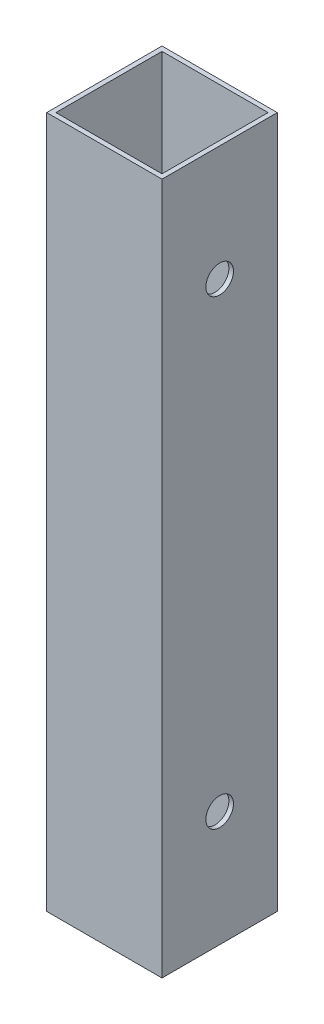
ISO-10303-21;
HEADER;
FILE_DESCRIPTION(('STEP AP214'),'2;1');
FILE_NAME('part.step','',(''),(''),'','','');
FILE_SCHEMA(('AUTOMOTIVE_DESIGN { 1 0 10303 214 1 1 1 1 }'));
ENDSEC;
DATA;
#1=APPLICATION_CONTEXT('core data for automotive mechanical design processes');
#2=APPLICATION_PROTOCOL_DEFINITION('international standard','automotive_design',2000,#1);
#3=PRODUCT_CONTEXT('',#1,'mechanical');
#4=PRODUCT('Part','Part','',(#3));
#5=PRODUCT_RELATED_PRODUCT_CATEGORY('part','',(#4));
#6=PRODUCT_DEFINITION_FORMATION('','',#4);
#7=PRODUCT_DEFINITION_CONTEXT('part definition',#1,'design');
#8=PRODUCT_DEFINITION('design','',#6,#7);
#9=PRODUCT_DEFINITION_SHAPE('','',#8);
#10=(LENGTH_UNIT() NAMED_UNIT(*) SI_UNIT(.MILLI.,.METRE.));
#11=(NAMED_UNIT(*) PLANE_ANGLE_UNIT() SI_UNIT($,.RADIAN.));
#12=(NAMED_UNIT(*) SI_UNIT($,.STERADIAN.) SOLID_ANGLE_UNIT());
#13=UNCERTAINTY_MEASURE_WITH_UNIT(LENGTH_MEASURE(1.E-05),#10,'distance_accuracy_value','');
#14=(GEOMETRIC_REPRESENTATION_CONTEXT(3) GLOBAL_UNCERTAINTY_ASSIGNED_CONTEXT((#13)) GLOBAL_UNIT_ASSIGNED_CONTEXT((#10,
#11,#12)) REPRESENTATION_CONTEXT('',''));
#15=CARTESIAN_POINT('',(0.,0.,0.));
#16=DIRECTION('',(0.,0.,1.));
#17=DIRECTION('',(1.,0.,0.));
#18=AXIS2_PLACEMENT_3D('',#15,#16,#17);
#19=CARTESIAN_POINT('',(0.,150.,0.));
#20=DIRECTION('',(0.,-1.,0.));
#21=DIRECTION('',(0.,0.,-1.));
#22=AXIS2_PLACEMENT_3D('',#19,#20,#21);
#23=PLANE('',#22);
#24=DIRECTION('',(0.,0.,-1.));
#25=VECTOR('',#24,1.);
#26=CARTESIAN_POINT('',(12.5,150.,12.5));
#27=LINE('',#26,#25);
#28=CARTESIAN_POINT('',(12.5,150.,12.5));
#29=VERTEX_POINT('',#28);
#30=CARTESIAN_POINT('',(12.5,150.,-12.5));
#31=VERTEX_POINT('',#30);
#32=EDGE_CURVE('E142',#29,#31,#27,.T.);
#33=ORIENTED_EDGE('',*,*,#32,.T.);
#34=DIRECTION('',(-1.,0.,0.));
#35=VECTOR('',#34,1.);
#36=CARTESIAN_POINT('',(-12.5,150.,-12.5));
#37=LINE('',#36,#35);
#38=CARTESIAN_POINT('',(-12.5,150.,-12.5));
#39=VERTEX_POINT('',#38);
#40=EDGE_CURVE('E145',#31,#39,#37,.T.);
#41=ORIENTED_EDGE('',*,*,#40,.T.);
#42=DIRECTION('',(0.,0.,1.));
#43=VECTOR('',#42,1.);
#44=CARTESIAN_POINT('',(-12.5,150.,12.5));
#45=LINE('',#44,#43);
#46=CARTESIAN_POINT('',(-12.5,150.,12.5));
#47=VERTEX_POINT('',#46);
#48=EDGE_CURVE('E148',#39,#47,#45,.T.);
#49=ORIENTED_EDGE('',*,*,#48,.T.);
#50=DIRECTION('',(1.,0.,0.));
#51=VECTOR('',#50,1.);
#52=CARTESIAN_POINT('',(-12.5,150.,12.5));
#53=LINE('',#52,#51);
#54=EDGE_CURVE('E150',#47,#29,#53,.T.);
#55=ORIENTED_EDGE('',*,*,#54,.T.);
#56=EDGE_LOOP('',(#33,#41,#49,#55));
#57=FACE_BOUND('',#56,.T.);
#58=DIRECTION('',(0.,0.,1.));
#59=VECTOR('',#58,1.);
#60=CARTESIAN_POINT('',(-11.5,150.,11.5));
#61=LINE('',#60,#59);
#62=CARTESIAN_POINT('',(-11.5,150.,-11.5));
#63=VERTEX_POINT('',#62);
#64=CARTESIAN_POINT('',(-11.5,150.,11.5));
#65=VERTEX_POINT('',#64);
#66=EDGE_CURVE('E104',#63,#65,#61,.T.);
#67=ORIENTED_EDGE('',*,*,#66,.F.);
#68=DIRECTION('',(-1.,0.,0.));
#69=VECTOR('',#68,1.);
#70=CARTESIAN_POINT('',(-11.5,150.,-11.5));
#71=LINE('',#70,#69);
#72=CARTESIAN_POINT('',(11.5,150.,-11.5));
#73=VERTEX_POINT('',#72);
#74=EDGE_CURVE('E126',#73,#63,#71,.T.);
#75=ORIENTED_EDGE('',*,*,#74,.F.);
#76=DIRECTION('',(0.,0.,-1.));
#77=VECTOR('',#76,1.);
#78=CARTESIAN_POINT('',(11.5,150.,11.5));
#79=LINE('',#78,#77);
#80=CARTESIAN_POINT('',(11.5,150.,11.5));
#81=VERTEX_POINT('',#80);
#82=EDGE_CURVE('E124',#81,#73,#79,.T.);
#83=ORIENTED_EDGE('',*,*,#82,.F.);
#84=DIRECTION('',(1.,0.,0.));
#85=VECTOR('',#84,1.);
#86=CARTESIAN_POINT('',(-11.5,150.,11.5));
#87=LINE('',#86,#85);
#88=EDGE_CURVE('E112',#65,#81,#87,.T.);
#89=ORIENTED_EDGE('',*,*,#88,.F.);
#90=EDGE_LOOP('',(#67,#75,#83,#89));
#91=FACE_BOUND('',#90,.T.);
#92=ADVANCED_FACE('F37',(#57,#91),#23,.F.);
#93=CARTESIAN_POINT('',(0.,0.,0.));
#94=DIRECTION('',(0.,-1.,0.));
#95=DIRECTION('',(0.,0.,-1.));
#96=AXIS2_PLACEMENT_3D('',#93,#94,#95);
#97=PLANE('',#96);
#98=DIRECTION('',(0.,0.,-1.));
#99=VECTOR('',#98,1.);
#100=CARTESIAN_POINT('',(12.5,0.,12.5));
#101=LINE('',#100,#99);
#102=CARTESIAN_POINT('',(12.5,0.,12.5));
#103=VERTEX_POINT('',#102);
#104=CARTESIAN_POINT('',(12.5,0.,-12.5));
#105=VERTEX_POINT('',#104);
#106=EDGE_CURVE('E120',#103,#105,#101,.T.);
#107=ORIENTED_EDGE('',*,*,#106,.F.);
#108=DIRECTION('',(1.,0.,0.));
#109=VECTOR('',#108,1.);
#110=CARTESIAN_POINT('',(-12.5,0.,12.5));
#111=LINE('',#110,#109);
#112=CARTESIAN_POINT('',(-12.5,0.,12.5));
#113=VERTEX_POINT('',#112);
#114=EDGE_CURVE('E146',#113,#103,#111,.T.);
#115=ORIENTED_EDGE('',*,*,#114,.F.);
#116=DIRECTION('',(0.,0.,1.));
#117=VECTOR('',#116,1.);
#118=CARTESIAN_POINT('',(-12.5,0.,12.5));
#119=LINE('',#118,#117);
#120=CARTESIAN_POINT('',(-12.5,0.,-12.5));
#121=VERTEX_POINT('',#120);
#122=EDGE_CURVE('E157',#121,#113,#119,.T.);
#123=ORIENTED_EDGE('',*,*,#122,.F.);
#124=DIRECTION('',(-1.,0.,0.));
#125=VECTOR('',#124,1.);
#126=CARTESIAN_POINT('',(-12.5,0.,-12.5));
#127=LINE('',#126,#125);
#128=EDGE_CURVE('E155',#105,#121,#127,.T.);
#129=ORIENTED_EDGE('',*,*,#128,.F.);
#130=EDGE_LOOP('',(#107,#115,#123,#129));
#131=FACE_BOUND('',#130,.T.);
#132=DIRECTION('',(-1.,0.,0.));
#133=VECTOR('',#132,1.);
#134=CARTESIAN_POINT('',(-11.5,0.,-11.5));
#135=LINE('',#134,#133);
#136=CARTESIAN_POINT('',(11.5,0.,-11.5));
#137=VERTEX_POINT('',#136);
#138=CARTESIAN_POINT('',(-11.5,0.,-11.5));
#139=VERTEX_POINT('',#138);
#140=EDGE_CURVE('E113',#137,#139,#135,.T.);
#141=ORIENTED_EDGE('',*,*,#140,.T.);
#142=DIRECTION('',(0.,0.,1.));
#143=VECTOR('',#142,1.);
#144=CARTESIAN_POINT('',(-11.5,0.,11.5));
#145=LINE('',#144,#143);
#146=CARTESIAN_POINT('',(-11.5,0.,11.5));
#147=VERTEX_POINT('',#146);
#148=EDGE_CURVE('E62',#139,#147,#145,.T.);
#149=ORIENTED_EDGE('',*,*,#148,.T.);
#150=DIRECTION('',(1.,0.,0.));
#151=VECTOR('',#150,1.);
#152=CARTESIAN_POINT('',(-11.5,0.,11.5));
#153=LINE('',#152,#151);
#154=CARTESIAN_POINT('',(11.5,0.,11.5));
#155=VERTEX_POINT('',#154);
#156=EDGE_CURVE('E119',#147,#155,#153,.T.);
#157=ORIENTED_EDGE('',*,*,#156,.T.);
#158=DIRECTION('',(0.,0.,-1.));
#159=VECTOR('',#158,1.);
#160=CARTESIAN_POINT('',(11.5,0.,11.5));
#161=LINE('',#160,#159);
#162=EDGE_CURVE('E134',#155,#137,#161,.T.);
#163=ORIENTED_EDGE('',*,*,#162,.T.);
#164=EDGE_LOOP('',(#141,#149,#157,#163));
#165=FACE_BOUND('',#164,.T.);
#166=ADVANCED_FACE('F204',(#131,#165),#97,.T.);
#167=CARTESIAN_POINT('',(12.5,150.,12.5));
#168=DIRECTION('',(-1.,0.,0.));
#169=DIRECTION('',(0.,0.,1.));
#170=AXIS2_PLACEMENT_3D('',#167,#168,#169);
#171=PLANE('',#170);
#172=CARTESIAN_POINT('',(12.5,125.,0.));
#173=DIRECTION('',(1.,0.,0.));
#174=DIRECTION('',(0.,0.,-1.));
#175=AXIS2_PLACEMENT_3D('',#172,#173,#174);
#176=CIRCLE('',#175,3.);
#177=CARTESIAN_POINT('',(12.5,125.,-3.));
#178=VERTEX_POINT('',#177);
#179=EDGE_CURVE('E175',#178,#178,#176,.T.);
#180=ORIENTED_EDGE('',*,*,#179,.F.);
#181=EDGE_LOOP('',(#180));
#182=FACE_BOUND('',#181,.T.);
#183=CARTESIAN_POINT('',(12.5,25.,0.));
#184=DIRECTION('',(1.,0.,0.));
#185=DIRECTION('',(0.,0.,-1.));
#186=AXIS2_PLACEMENT_3D('',#183,#184,#185);
#187=CIRCLE('',#186,3.);
#188=CARTESIAN_POINT('',(12.5,25.,-3.));
#189=VERTEX_POINT('',#188);
#190=EDGE_CURVE('E180',#189,#189,#187,.T.);
#191=ORIENTED_EDGE('',*,*,#190,.F.);
#192=EDGE_LOOP('',(#191));
#193=FACE_BOUND('',#192,.T.);
#194=ORIENTED_EDGE('',*,*,#106,.T.);
#195=DIRECTION('',(0.,-1.,0.));
#196=VECTOR('',#195,1.);
#197=CARTESIAN_POINT('',(12.5,150.,-12.5));
#198=LINE('',#197,#196);
#199=EDGE_CURVE('E11',#31,#105,#198,.T.);
#200=ORIENTED_EDGE('',*,*,#199,.F.);
#201=ORIENTED_EDGE('',*,*,#32,.F.);
#202=DIRECTION('',(0.,-1.,0.));
#203=VECTOR('',#202,1.);
#204=CARTESIAN_POINT('',(12.5,150.,12.5));
#205=LINE('',#204,#203);
#206=EDGE_CURVE('E152',#29,#103,#205,.T.);
#207=ORIENTED_EDGE('',*,*,#206,.T.);
#208=EDGE_LOOP('',(#194,#200,#201,#207));
#209=FACE_BOUND('',#208,.T.);
#210=ADVANCED_FACE('F39',(#182,#193,#209),#171,.F.);
#211=CARTESIAN_POINT('',(-12.5,150.,-12.5));
#212=DIRECTION('',(0.,0.,1.));
#213=DIRECTION('',(1.,0.,0.));
#214=AXIS2_PLACEMENT_3D('',#211,#212,#213);
#215=PLANE('',#214);
#216=ORIENTED_EDGE('',*,*,#128,.T.);
#217=DIRECTION('',(0.,-1.,0.));
#218=VECTOR('',#217,1.);
#219=CARTESIAN_POINT('',(-12.5,150.,-12.5));
#220=LINE('',#219,#218);
#221=EDGE_CURVE('E46',#39,#121,#220,.T.);
#222=ORIENTED_EDGE('',*,*,#221,.F.);
#223=ORIENTED_EDGE('',*,*,#40,.F.);
#224=ORIENTED_EDGE('',*,*,#199,.T.);
#225=EDGE_LOOP('',(#216,#222,#223,#224));
#226=FACE_BOUND('',#225,.T.);
#227=ADVANCED_FACE('F230',(#226),#215,.F.);
#228=CARTESIAN_POINT('',(-12.5,150.,12.5));
#229=DIRECTION('',(1.,0.,0.));
#230=DIRECTION('',(0.,0.,-1.));
#231=AXIS2_PLACEMENT_3D('',#228,#229,#230);
#232=PLANE('',#231);
#233=CARTESIAN_POINT('',(-12.5,125.,0.));
#234=DIRECTION('',(1.,0.,0.));
#235=DIRECTION('',(0.,0.,-1.));
#236=AXIS2_PLACEMENT_3D('',#233,#234,#235);
#237=CIRCLE('',#236,3.);
#238=CARTESIAN_POINT('',(-12.5,125.,-3.));
#239=VERTEX_POINT('',#238);
#240=EDGE_CURVE('E169',#239,#239,#237,.T.);
#241=ORIENTED_EDGE('',*,*,#240,.T.);
#242=EDGE_LOOP('',(#241));
#243=FACE_BOUND('',#242,.T.);
#244=CARTESIAN_POINT('',(-12.5,25.,0.));
#245=DIRECTION('',(1.,0.,0.));
#246=DIRECTION('',(0.,0.,-1.));
#247=AXIS2_PLACEMENT_3D('',#244,#245,#246);
#248=CIRCLE('',#247,3.);
#249=CARTESIAN_POINT('',(-12.5,25.,-3.));
#250=VERTEX_POINT('',#249);
#251=EDGE_CURVE('E185',#250,#250,#248,.T.);
#252=ORIENTED_EDGE('',*,*,#251,.T.);
#253=EDGE_LOOP('',(#252));
#254=FACE_BOUND('',#253,.T.);
#255=ORIENTED_EDGE('',*,*,#122,.T.);
#256=DIRECTION('',(0.,-1.,0.));
#257=VECTOR('',#256,1.);
#258=CARTESIAN_POINT('',(-12.5,150.,12.5));
#259=LINE('',#258,#257);
#260=EDGE_CURVE('E162',#47,#113,#259,.T.);
#261=ORIENTED_EDGE('',*,*,#260,.F.);
#262=ORIENTED_EDGE('',*,*,#48,.F.);
#263=ORIENTED_EDGE('',*,*,#221,.T.);
#264=EDGE_LOOP('',(#255,#261,#262,#263));
#265=FACE_BOUND('',#264,.T.);
#266=ADVANCED_FACE('F227',(#243,#254,#265),#232,.F.);
#267=CARTESIAN_POINT('',(-12.5,150.,12.5));
#268=DIRECTION('',(0.,0.,-1.));
#269=DIRECTION('',(-1.,0.,0.));
#270=AXIS2_PLACEMENT_3D('',#267,#268,#269);
#271=PLANE('',#270);
#272=ORIENTED_EDGE('',*,*,#114,.T.);
#273=ORIENTED_EDGE('',*,*,#206,.F.);
#274=ORIENTED_EDGE('',*,*,#54,.F.);
#275=ORIENTED_EDGE('',*,*,#260,.T.);
#276=EDGE_LOOP('',(#272,#273,#274,#275));
#277=FACE_BOUND('',#276,.T.);
#278=ADVANCED_FACE('F224',(#277),#271,.F.);
#279=CARTESIAN_POINT('',(-11.5,150.,11.5));
#280=DIRECTION('',(1.,0.,0.));
#281=DIRECTION('',(0.,0.,-1.));
#282=AXIS2_PLACEMENT_3D('',#279,#280,#281);
#283=PLANE('',#282);
#284=CARTESIAN_POINT('',(-11.5,125.,0.));
#285=DIRECTION('',(1.,0.,0.));
#286=DIRECTION('',(0.,0.,-1.));
#287=AXIS2_PLACEMENT_3D('',#284,#285,#286);
#288=CIRCLE('',#287,3.);
#289=CARTESIAN_POINT('',(-11.5,125.,-3.));
#290=VERTEX_POINT('',#289);
#291=EDGE_CURVE('E132',#290,#290,#288,.T.);
#292=ORIENTED_EDGE('',*,*,#291,.F.);
#293=EDGE_LOOP('',(#292));
#294=FACE_BOUND('',#293,.T.);
#295=CARTESIAN_POINT('',(-11.5,25.,0.));
#296=DIRECTION('',(1.,0.,0.));
#297=DIRECTION('',(0.,0.,-1.));
#298=AXIS2_PLACEMENT_3D('',#295,#296,#297);
#299=CIRCLE('',#298,3.);
#300=CARTESIAN_POINT('',(-11.5,25.,-3.));
#301=VERTEX_POINT('',#300);
#302=EDGE_CURVE('E168',#301,#301,#299,.T.);
#303=ORIENTED_EDGE('',*,*,#302,.F.);
#304=EDGE_LOOP('',(#303));
#305=FACE_BOUND('',#304,.T.);
#306=ORIENTED_EDGE('',*,*,#148,.F.);
#307=DIRECTION('',(0.,-1.,0.));
#308=VECTOR('',#307,1.);
#309=CARTESIAN_POINT('',(-11.5,150.,-11.5));
#310=LINE('',#309,#308);
#311=EDGE_CURVE('E108',#63,#139,#310,.T.);
#312=ORIENTED_EDGE('',*,*,#311,.F.);
#313=ORIENTED_EDGE('',*,*,#66,.T.);
#314=DIRECTION('',(0.,-1.,0.));
#315=VECTOR('',#314,1.);
#316=CARTESIAN_POINT('',(-11.5,150.,11.5));
#317=LINE('',#316,#315);
#318=EDGE_CURVE('E107',#65,#147,#317,.T.);
#319=ORIENTED_EDGE('',*,*,#318,.T.);
#320=EDGE_LOOP('',(#306,#312,#313,#319));
#321=FACE_BOUND('',#320,.T.);
#322=ADVANCED_FACE('F106',(#294,#305,#321),#283,.T.);
#323=CARTESIAN_POINT('',(-11.5,150.,11.5));
#324=DIRECTION('',(0.,0.,-1.));
#325=DIRECTION('',(-1.,0.,0.));
#326=AXIS2_PLACEMENT_3D('',#323,#324,#325);
#327=PLANE('',#326);
#328=ORIENTED_EDGE('',*,*,#156,.F.);
#329=ORIENTED_EDGE('',*,*,#318,.F.);
#330=ORIENTED_EDGE('',*,*,#88,.T.);
#331=DIRECTION('',(0.,-1.,0.));
#332=VECTOR('',#331,1.);
#333=CARTESIAN_POINT('',(11.5,150.,11.5));
#334=LINE('',#333,#332);
#335=EDGE_CURVE('E121',#81,#155,#334,.T.);
#336=ORIENTED_EDGE('',*,*,#335,.T.);
#337=EDGE_LOOP('',(#328,#329,#330,#336));
#338=FACE_BOUND('',#337,.T.);
#339=ADVANCED_FACE('F116',(#338),#327,.T.);
#340=CARTESIAN_POINT('',(11.5,150.,11.5));
#341=DIRECTION('',(-1.,0.,0.));
#342=DIRECTION('',(0.,0.,1.));
#343=AXIS2_PLACEMENT_3D('',#340,#341,#342);
#344=PLANE('',#343);
#345=CARTESIAN_POINT('',(11.5,125.,0.));
#346=DIRECTION('',(-1.,0.,0.));
#347=DIRECTION('',(0.,0.,1.));
#348=AXIS2_PLACEMENT_3D('',#345,#346,#347);
#349=CIRCLE('',#348,3.);
#350=CARTESIAN_POINT('',(11.5,125.,3.));
#351=VERTEX_POINT('',#350);
#352=EDGE_CURVE('E41',#351,#351,#349,.T.);
#353=ORIENTED_EDGE('',*,*,#352,.F.);
#354=EDGE_LOOP('',(#353));
#355=FACE_BOUND('',#354,.T.);
#356=CARTESIAN_POINT('',(11.5,25.,0.));
#357=DIRECTION('',(-1.,0.,0.));
#358=DIRECTION('',(0.,0.,1.));
#359=AXIS2_PLACEMENT_3D('',#356,#357,#358);
#360=CIRCLE('',#359,3.);
#361=CARTESIAN_POINT('',(11.5,25.,3.));
#362=VERTEX_POINT('',#361);
#363=EDGE_CURVE('E166',#362,#362,#360,.T.);
#364=ORIENTED_EDGE('',*,*,#363,.F.);
#365=EDGE_LOOP('',(#364));
#366=FACE_BOUND('',#365,.T.);
#367=ORIENTED_EDGE('',*,*,#162,.F.);
#368=ORIENTED_EDGE('',*,*,#335,.F.);
#369=ORIENTED_EDGE('',*,*,#82,.T.);
#370=DIRECTION('',(0.,-1.,0.));
#371=VECTOR('',#370,1.);
#372=CARTESIAN_POINT('',(11.5,150.,-11.5));
#373=LINE('',#372,#371);
#374=EDGE_CURVE('E54',#73,#137,#373,.T.);
#375=ORIENTED_EDGE('',*,*,#374,.T.);
#376=EDGE_LOOP('',(#367,#368,#369,#375));
#377=FACE_BOUND('',#376,.T.);
#378=ADVANCED_FACE('F196',(#355,#366,#377),#344,.T.);
#379=CARTESIAN_POINT('',(-11.5,150.,-11.5));
#380=DIRECTION('',(0.,0.,1.));
#381=DIRECTION('',(1.,0.,0.));
#382=AXIS2_PLACEMENT_3D('',#379,#380,#381);
#383=PLANE('',#382);
#384=ORIENTED_EDGE('',*,*,#140,.F.);
#385=ORIENTED_EDGE('',*,*,#374,.F.);
#386=ORIENTED_EDGE('',*,*,#74,.T.);
#387=ORIENTED_EDGE('',*,*,#311,.T.);
#388=EDGE_LOOP('',(#384,#385,#386,#387));
#389=FACE_BOUND('',#388,.T.);
#390=ADVANCED_FACE('F199',(#389),#383,.T.);
#391=CARTESIAN_POINT('',(-12.5,25.,0.));
#392=DIRECTION('',(1.,0.,0.));
#393=DIRECTION('',(0.,0.,-1.));
#394=AXIS2_PLACEMENT_3D('',#391,#392,#393);
#395=CYLINDRICAL_SURFACE('',#394,3.);
#396=ORIENTED_EDGE('',*,*,#363,.T.);
#397=EDGE_LOOP('',(#396));
#398=FACE_BOUND('',#397,.T.);
#399=ORIENTED_EDGE('',*,*,#190,.T.);
#400=EDGE_LOOP('',(#399));
#401=FACE_BOUND('',#400,.T.);
#402=ADVANCED_FACE('F206',(#398,#401),#395,.F.);
#403=CARTESIAN_POINT('',(-12.5,125.,0.));
#404=DIRECTION('',(1.,0.,0.));
#405=DIRECTION('',(0.,0.,-1.));
#406=AXIS2_PLACEMENT_3D('',#403,#404,#405);
#407=CYLINDRICAL_SURFACE('',#406,3.);
#408=ORIENTED_EDGE('',*,*,#352,.T.);
#409=EDGE_LOOP('',(#408));
#410=FACE_BOUND('',#409,.T.);
#411=ORIENTED_EDGE('',*,*,#179,.T.);
#412=EDGE_LOOP('',(#411));
#413=FACE_BOUND('',#412,.T.);
#414=ADVANCED_FACE('F193',(#410,#413),#407,.F.);
#415=ORIENTED_EDGE('',*,*,#302,.T.);
#416=EDGE_LOOP('',(#415));
#417=FACE_BOUND('',#416,.T.);
#418=ORIENTED_EDGE('',*,*,#251,.F.);
#419=EDGE_LOOP('',(#418));
#420=FACE_BOUND('',#419,.T.);
#421=ADVANCED_FACE('F212',(#417,#420),#395,.F.);
#422=ORIENTED_EDGE('',*,*,#291,.T.);
#423=EDGE_LOOP('',(#422));
#424=FACE_BOUND('',#423,.T.);
#425=ORIENTED_EDGE('',*,*,#240,.F.);
#426=EDGE_LOOP('',(#425));
#427=FACE_BOUND('',#426,.T.);
#428=ADVANCED_FACE('F257',(#424,#427),#407,.F.);
#429=CLOSED_SHELL('',(#92,#166,#210,#227,#266,#278,#322,#339,#378,#390,#402,#414,#421,#428));
#430=MANIFOLD_SOLID_BREP('B2',#429);
#431=ADVANCED_BREP_SHAPE_REPRESENTATION('',(#18,#430),#14);
#432=SHAPE_DEFINITION_REPRESENTATION(#9,#431);
ENDSEC;
END-ISO-10303-21;
